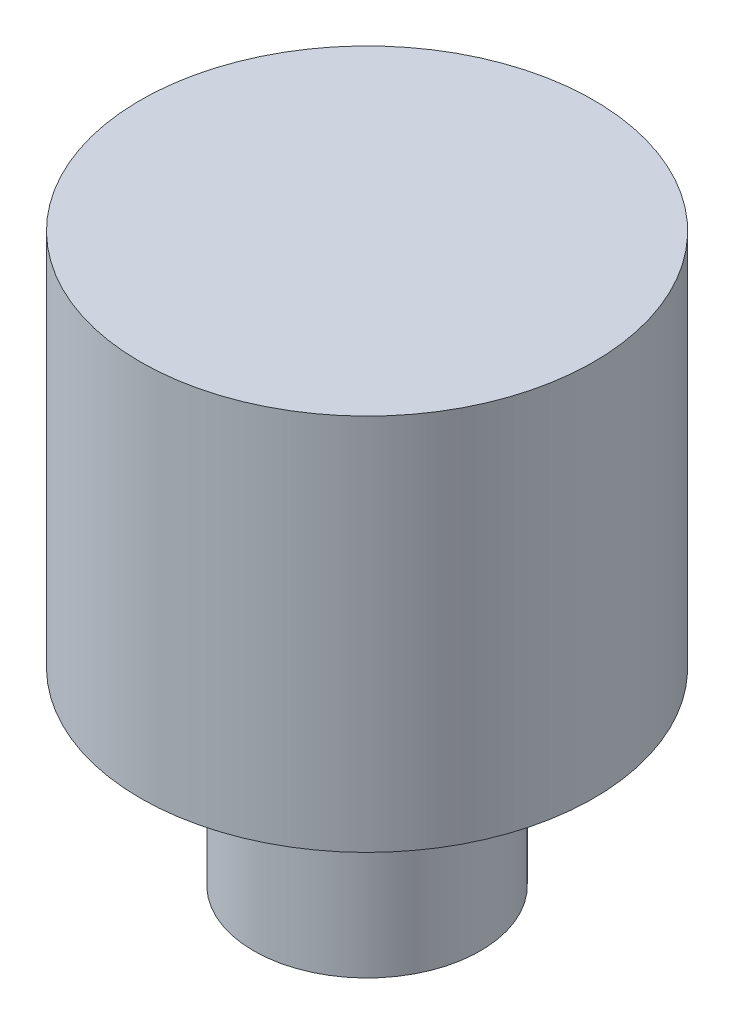
ISO-10303-21;
HEADER;
FILE_DESCRIPTION(('STEP AP214'),'2;1');
FILE_NAME('part.step','',(''),(''),'','','');
FILE_SCHEMA(('AUTOMOTIVE_DESIGN { 1 0 10303 214 1 1 1 1 }'));
ENDSEC;
DATA;
#1=APPLICATION_CONTEXT('core data for automotive mechanical design processes');
#2=APPLICATION_PROTOCOL_DEFINITION('international standard','automotive_design',2000,#1);
#3=PRODUCT_CONTEXT('',#1,'mechanical');
#4=PRODUCT('Part','Part','',(#3));
#5=PRODUCT_RELATED_PRODUCT_CATEGORY('part','',(#4));
#6=PRODUCT_DEFINITION_FORMATION('','',#4);
#7=PRODUCT_DEFINITION_CONTEXT('part definition',#1,'design');
#8=PRODUCT_DEFINITION('design','',#6,#7);
#9=PRODUCT_DEFINITION_SHAPE('','',#8);
#10=(LENGTH_UNIT() NAMED_UNIT(*) SI_UNIT(.MILLI.,.METRE.));
#11=(NAMED_UNIT(*) PLANE_ANGLE_UNIT() SI_UNIT($,.RADIAN.));
#12=(NAMED_UNIT(*) SI_UNIT($,.STERADIAN.) SOLID_ANGLE_UNIT());
#13=UNCERTAINTY_MEASURE_WITH_UNIT(LENGTH_MEASURE(1.E-05),#10,'distance_accuracy_value','');
#14=(GEOMETRIC_REPRESENTATION_CONTEXT(3) GLOBAL_UNCERTAINTY_ASSIGNED_CONTEXT((#13)) GLOBAL_UNIT_ASSIGNED_CONTEXT((#10,
#11,#12)) REPRESENTATION_CONTEXT('',''));
#15=CARTESIAN_POINT('',(0.,0.,0.));
#16=DIRECTION('',(0.,0.,1.));
#17=DIRECTION('',(1.,0.,0.));
#18=AXIS2_PLACEMENT_3D('',#15,#16,#17);
#19=CARTESIAN_POINT('',(0.,127.,0.));
#20=DIRECTION('',(0.,-1.,0.));
#21=DIRECTION('',(0.,0.,-1.));
#22=AXIS2_PLACEMENT_3D('',#19,#20,#21);
#23=CYLINDRICAL_SURFACE('',#22,76.2);
#24=CARTESIAN_POINT('',(0.,127.,0.));
#25=DIRECTION('',(0.,1.,0.));
#26=DIRECTION('',(0.,0.,1.));
#27=AXIS2_PLACEMENT_3D('',#24,#25,#26);
#28=CIRCLE('',#27,76.2);
#29=CARTESIAN_POINT('',(0.,127.,76.2));
#30=VERTEX_POINT('',#29);
#31=EDGE_CURVE('E48',#30,#30,#28,.T.);
#32=ORIENTED_EDGE('',*,*,#31,.F.);
#33=EDGE_LOOP('',(#32));
#34=FACE_BOUND('',#33,.T.);
#35=CARTESIAN_POINT('',(0.,0.,0.));
#36=DIRECTION('',(0.,1.,0.));
#37=DIRECTION('',(0.,0.,1.));
#38=AXIS2_PLACEMENT_3D('',#35,#36,#37);
#39=CIRCLE('',#38,76.2);
#40=CARTESIAN_POINT('',(0.,0.,76.2));
#41=VERTEX_POINT('',#40);
#42=EDGE_CURVE('E44',#41,#41,#39,.T.);
#43=ORIENTED_EDGE('',*,*,#42,.T.);
#44=EDGE_LOOP('',(#43));
#45=FACE_BOUND('',#44,.T.);
#46=ADVANCED_FACE('F41',(#34,#45),#23,.T.);
#47=CARTESIAN_POINT('',(0.,127.,0.));
#48=DIRECTION('',(0.,1.,0.));
#49=DIRECTION('',(0.,0.,1.));
#50=AXIS2_PLACEMENT_3D('',#47,#48,#49);
#51=PLANE('',#50);
#52=ORIENTED_EDGE('',*,*,#31,.T.);
#53=EDGE_LOOP('',(#52));
#54=FACE_BOUND('',#53,.T.);
#55=ADVANCED_FACE('F65',(#54),#51,.T.);
#56=CARTESIAN_POINT('',(0.,0.,0.));
#57=DIRECTION('',(0.,1.,0.));
#58=DIRECTION('',(0.,0.,1.));
#59=AXIS2_PLACEMENT_3D('',#56,#57,#58);
#60=PLANE('',#59);
#61=CARTESIAN_POINT('',(0.,0.,0.));
#62=DIRECTION('',(0.,-1.,0.));
#63=DIRECTION('',(0.,0.,-1.));
#64=AXIS2_PLACEMENT_3D('',#61,#62,#63);
#65=CIRCLE('',#64,38.1);
#66=CARTESIAN_POINT('',(0.,0.,-38.1));
#67=VERTEX_POINT('',#66);
#68=EDGE_CURVE('E10',#67,#67,#65,.T.);
#69=ORIENTED_EDGE('',*,*,#68,.F.);
#70=EDGE_LOOP('',(#69));
#71=FACE_BOUND('',#70,.T.);
#72=ORIENTED_EDGE('',*,*,#42,.F.);
#73=EDGE_LOOP('',(#72));
#74=FACE_BOUND('',#73,.T.);
#75=ADVANCED_FACE('F62',(#71,#74),#60,.F.);
#76=CARTESIAN_POINT('',(0.,-63.5,0.));
#77=DIRECTION('',(0.,1.,0.));
#78=DIRECTION('',(0.,0.,1.));
#79=AXIS2_PLACEMENT_3D('',#76,#77,#78);
#80=CYLINDRICAL_SURFACE('',#79,38.1);
#81=CARTESIAN_POINT('',(0.,-63.5,0.));
#82=DIRECTION('',(0.,-1.,0.));
#83=DIRECTION('',(0.,0.,-1.));
#84=AXIS2_PLACEMENT_3D('',#81,#82,#83);
#85=CIRCLE('',#84,38.1);
#86=CARTESIAN_POINT('',(0.,-63.5,-38.1));
#87=VERTEX_POINT('',#86);
#88=EDGE_CURVE('E54',#87,#87,#85,.T.);
#89=ORIENTED_EDGE('',*,*,#88,.F.);
#90=EDGE_LOOP('',(#89));
#91=FACE_BOUND('',#90,.T.);
#92=ORIENTED_EDGE('',*,*,#68,.T.);
#93=EDGE_LOOP('',(#92));
#94=FACE_BOUND('',#93,.T.);
#95=ADVANCED_FACE('F64',(#91,#94),#80,.T.);
#96=CARTESIAN_POINT('',(0.,-63.5,0.));
#97=DIRECTION('',(0.,-1.,0.));
#98=DIRECTION('',(0.,0.,-1.));
#99=AXIS2_PLACEMENT_3D('',#96,#97,#98);
#100=PLANE('',#99);
#101=ORIENTED_EDGE('',*,*,#88,.T.);
#102=EDGE_LOOP('',(#101));
#103=FACE_BOUND('',#102,.T.);
#104=ADVANCED_FACE('F71',(#103),#100,.T.);
#105=CLOSED_SHELL('',(#46,#55,#75,#95,#104));
#106=MANIFOLD_SOLID_BREP('B2',#105);
#107=ADVANCED_BREP_SHAPE_REPRESENTATION('',(#18,#106),#14);
#108=SHAPE_DEFINITION_REPRESENTATION(#9,#107);
ENDSEC;
END-ISO-10303-21;
